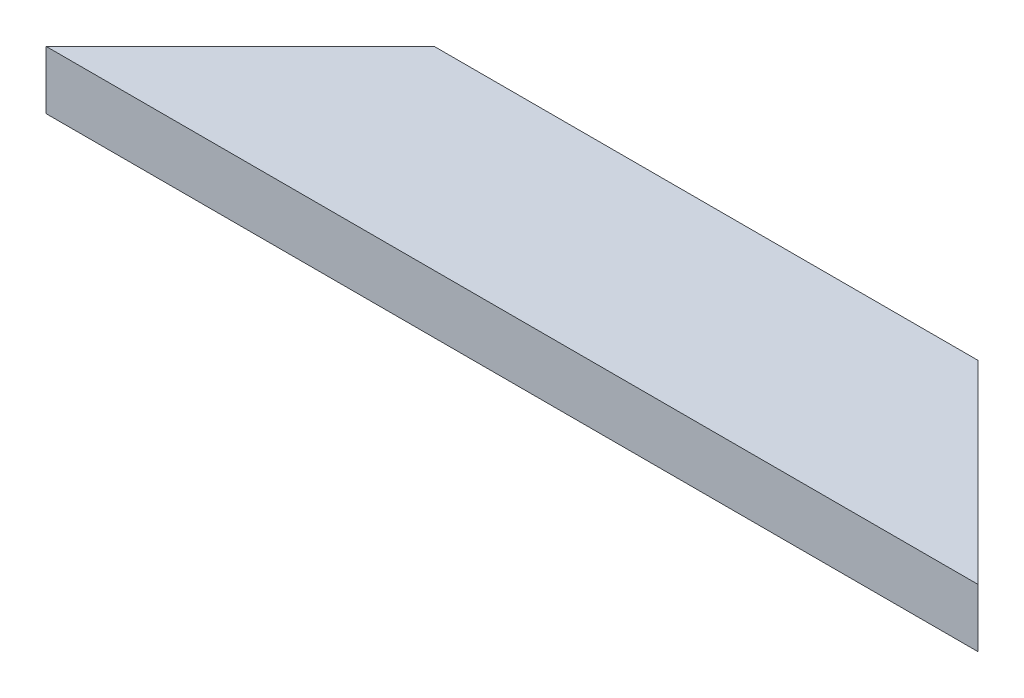
ISO-10303-21;
HEADER;
FILE_DESCRIPTION(('STEP AP214'),'2;1');
FILE_NAME('part.step','',(''),(''),'','','');
FILE_SCHEMA(('AUTOMOTIVE_DESIGN { 1 0 10303 214 1 1 1 1 }'));
ENDSEC;
DATA;
#1=APPLICATION_CONTEXT('core data for automotive mechanical design processes');
#2=APPLICATION_PROTOCOL_DEFINITION('international standard','automotive_design',2000,#1);
#3=PRODUCT_CONTEXT('',#1,'mechanical');
#4=PRODUCT('Part','Part','',(#3));
#5=PRODUCT_RELATED_PRODUCT_CATEGORY('part','',(#4));
#6=PRODUCT_DEFINITION_FORMATION('','',#4);
#7=PRODUCT_DEFINITION_CONTEXT('part definition',#1,'design');
#8=PRODUCT_DEFINITION('design','',#6,#7);
#9=PRODUCT_DEFINITION_SHAPE('','',#8);
#10=(LENGTH_UNIT() NAMED_UNIT(*) SI_UNIT(.MILLI.,.METRE.));
#11=(NAMED_UNIT(*) PLANE_ANGLE_UNIT() SI_UNIT($,.RADIAN.));
#12=(NAMED_UNIT(*) SI_UNIT($,.STERADIAN.) SOLID_ANGLE_UNIT());
#13=UNCERTAINTY_MEASURE_WITH_UNIT(LENGTH_MEASURE(1.E-05),#10,'distance_accuracy_value','');
#14=(GEOMETRIC_REPRESENTATION_CONTEXT(3) GLOBAL_UNCERTAINTY_ASSIGNED_CONTEXT((#13)) GLOBAL_UNIT_ASSIGNED_CONTEXT((#10,
#11,#12)) REPRESENTATION_CONTEXT('',''));
#15=CARTESIAN_POINT('',(0.,0.,0.));
#16=DIRECTION('',(0.,0.,1.));
#17=DIRECTION('',(1.,0.,0.));
#18=AXIS2_PLACEMENT_3D('',#15,#16,#17);
#19=CARTESIAN_POINT('',(71.7394483190541,19.05,-52.9788447933238));
#20=DIRECTION('',(0.707106781186539,0.,-0.707106781186556));
#21=DIRECTION('',(-0.707106781186556,0.,-0.707106781186539));
#22=AXIS2_PLACEMENT_3D('',#19,#20,#21);
#23=PLANE('',#22);
#24=DIRECTION('',(0.707106781186556,0.,0.707106781186539));
#25=VECTOR('',#24,1.);
#26=CARTESIAN_POINT('',(71.7394483190541,0.,-52.9788447933238));
#27=LINE('',#26,#25);
#28=CARTESIAN_POINT('',(71.7394483190541,0.,-52.9788447933238));
#29=VERTEX_POINT('',#28);
#30=CARTESIAN_POINT('',(135.168830646847,0.,10.4505375344672));
#31=VERTEX_POINT('',#30);
#32=EDGE_CURVE('E97',#29,#31,#27,.T.);
#33=ORIENTED_EDGE('',*,*,#32,.F.);
#34=DIRECTION('',(0.,-1.,0.));
#35=VECTOR('',#34,1.);
#36=CARTESIAN_POINT('',(71.7394483190541,19.05,-52.9788447933238));
#37=LINE('',#36,#35);
#38=CARTESIAN_POINT('',(71.7394483190541,19.05,-52.9788447933238));
#39=VERTEX_POINT('',#38);
#40=EDGE_CURVE('E11',#39,#29,#37,.T.);
#41=ORIENTED_EDGE('',*,*,#40,.F.);
#42=DIRECTION('',(0.707106781186556,0.,0.707106781186539));
#43=VECTOR('',#42,1.);
#44=CARTESIAN_POINT('',(71.7394483190541,19.05,-52.9788447933238));
#45=LINE('',#44,#43);
#46=CARTESIAN_POINT('',(135.168830646847,19.05,10.4505375344672));
#47=VERTEX_POINT('',#46);
#48=EDGE_CURVE('E91',#39,#47,#45,.T.);
#49=ORIENTED_EDGE('',*,*,#48,.T.);
#50=DIRECTION('',(0.,-1.,0.));
#51=VECTOR('',#50,1.);
#52=CARTESIAN_POINT('',(135.168830646847,19.05,10.4505375344672));
#53=LINE('',#52,#51);
#54=EDGE_CURVE('E36',#47,#31,#53,.T.);
#55=ORIENTED_EDGE('',*,*,#54,.T.);
#56=EDGE_LOOP('',(#33,#41,#49,#55));
#57=FACE_BOUND('',#56,.T.);
#58=ADVANCED_FACE('F33',(#57),#23,.T.);
#59=CARTESIAN_POINT('',(-106.060551680946,19.05,-52.978844793324));
#60=DIRECTION('',(0.,0.,-1.));
#61=DIRECTION('',(-1.,0.,0.));
#62=AXIS2_PLACEMENT_3D('',#59,#60,#61);
#63=PLANE('',#62);
#64=DIRECTION('',(1.,0.,0.));
#65=VECTOR('',#64,1.);
#66=CARTESIAN_POINT('',(-106.060551680946,0.,-52.978844793324));
#67=LINE('',#66,#65);
#68=CARTESIAN_POINT('',(-106.060551680946,0.,-52.978844793324));
#69=VERTEX_POINT('',#68);
#70=EDGE_CURVE('E93',#69,#29,#67,.T.);
#71=ORIENTED_EDGE('',*,*,#70,.F.);
#72=DIRECTION('',(0.,-1.,0.));
#73=VECTOR('',#72,1.);
#74=CARTESIAN_POINT('',(-106.060551680946,19.05,-52.978844793324));
#75=LINE('',#74,#73);
#76=CARTESIAN_POINT('',(-106.060551680946,19.05,-52.978844793324));
#77=VERTEX_POINT('',#76);
#78=EDGE_CURVE('E42',#77,#69,#75,.T.);
#79=ORIENTED_EDGE('',*,*,#78,.F.);
#80=DIRECTION('',(1.,0.,0.));
#81=VECTOR('',#80,1.);
#82=CARTESIAN_POINT('',(-106.060551680946,19.05,-52.978844793324));
#83=LINE('',#82,#81);
#84=EDGE_CURVE('E84',#77,#39,#83,.T.);
#85=ORIENTED_EDGE('',*,*,#84,.T.);
#86=ORIENTED_EDGE('',*,*,#40,.T.);
#87=EDGE_LOOP('',(#71,#79,#85,#86));
#88=FACE_BOUND('',#87,.T.);
#89=ADVANCED_FACE('F107',(#88),#63,.T.);
#90=CARTESIAN_POINT('',(-106.060551680946,19.05,-52.978844793324));
#91=DIRECTION('',(0.707106781186549,0.,0.707106781186546));
#92=DIRECTION('',(0.707106781186546,0.,-0.707106781186549));
#93=AXIS2_PLACEMENT_3D('',#90,#91,#92);
#94=PLANE('',#93);
#95=DIRECTION('',(-0.707106781186546,0.,0.707106781186549));
#96=VECTOR('',#95,1.);
#97=CARTESIAN_POINT('',(-106.060551680946,0.,-52.978844793324));
#98=LINE('',#97,#96);
#99=CARTESIAN_POINT('',(-169.489934008737,0.,10.4505375344674));
#100=VERTEX_POINT('',#99);
#101=EDGE_CURVE('E88',#69,#100,#98,.T.);
#102=ORIENTED_EDGE('',*,*,#101,.T.);
#103=DIRECTION('',(0.,-1.,0.));
#104=VECTOR('',#103,1.);
#105=CARTESIAN_POINT('',(-169.489934008737,19.05,10.4505375344674));
#106=LINE('',#105,#104);
#107=CARTESIAN_POINT('',(-169.489934008737,19.05,10.4505375344674));
#108=VERTEX_POINT('',#107);
#109=EDGE_CURVE('E86',#108,#100,#106,.T.);
#110=ORIENTED_EDGE('',*,*,#109,.F.);
#111=DIRECTION('',(-0.707106781186546,0.,0.707106781186549));
#112=VECTOR('',#111,1.);
#113=CARTESIAN_POINT('',(-106.060551680946,19.05,-52.978844793324));
#114=LINE('',#113,#112);
#115=EDGE_CURVE('E80',#77,#108,#114,.T.);
#116=ORIENTED_EDGE('',*,*,#115,.F.);
#117=ORIENTED_EDGE('',*,*,#78,.T.);
#118=EDGE_LOOP('',(#102,#110,#116,#117));
#119=FACE_BOUND('',#118,.T.);
#120=ADVANCED_FACE('F87',(#119),#94,.F.);
#121=CARTESIAN_POINT('',(135.168830646847,19.05,10.4505375344672));
#122=DIRECTION('',(0.,0.,1.));
#123=DIRECTION('',(1.,0.,0.));
#124=AXIS2_PLACEMENT_3D('',#121,#122,#123);
#125=PLANE('',#124);
#126=DIRECTION('',(-1.,0.,0.));
#127=VECTOR('',#126,1.);
#128=CARTESIAN_POINT('',(135.168830646847,0.,10.4505375344672));
#129=LINE('',#128,#127);
#130=EDGE_CURVE('E100',#31,#100,#129,.T.);
#131=ORIENTED_EDGE('',*,*,#130,.F.);
#132=ORIENTED_EDGE('',*,*,#54,.F.);
#133=DIRECTION('',(-1.,0.,0.));
#134=VECTOR('',#133,1.);
#135=CARTESIAN_POINT('',(135.168830646847,19.05,10.4505375344672));
#136=LINE('',#135,#134);
#137=EDGE_CURVE('E83',#47,#108,#136,.T.);
#138=ORIENTED_EDGE('',*,*,#137,.T.);
#139=ORIENTED_EDGE('',*,*,#109,.T.);
#140=EDGE_LOOP('',(#131,#132,#138,#139));
#141=FACE_BOUND('',#140,.T.);
#142=ADVANCED_FACE('F90',(#141),#125,.T.);
#143=CARTESIAN_POINT('',(0.,19.05,0.));
#144=DIRECTION('',(0.,-1.,0.));
#145=DIRECTION('',(0.,0.,-1.));
#146=AXIS2_PLACEMENT_3D('',#143,#144,#145);
#147=PLANE('',#146);
#148=ORIENTED_EDGE('',*,*,#48,.F.);
#149=ORIENTED_EDGE('',*,*,#84,.F.);
#150=ORIENTED_EDGE('',*,*,#115,.T.);
#151=ORIENTED_EDGE('',*,*,#137,.F.);
#152=EDGE_LOOP('',(#148,#149,#150,#151));
#153=FACE_BOUND('',#152,.T.);
#154=ADVANCED_FACE('F82',(#153),#147,.F.);
#155=CARTESIAN_POINT('',(0.,0.,0.));
#156=DIRECTION('',(0.,-1.,0.));
#157=DIRECTION('',(0.,0.,-1.));
#158=AXIS2_PLACEMENT_3D('',#155,#156,#157);
#159=PLANE('',#158);
#160=ORIENTED_EDGE('',*,*,#32,.T.);
#161=ORIENTED_EDGE('',*,*,#130,.T.);
#162=ORIENTED_EDGE('',*,*,#101,.F.);
#163=ORIENTED_EDGE('',*,*,#70,.T.);
#164=EDGE_LOOP('',(#160,#161,#162,#163));
#165=FACE_BOUND('',#164,.T.);
#166=ADVANCED_FACE('F106',(#165),#159,.T.);
#167=CLOSED_SHELL('',(#58,#89,#120,#142,#154,#166));
#168=MANIFOLD_SOLID_BREP('B2',#167);
#169=ADVANCED_BREP_SHAPE_REPRESENTATION('',(#18,#168),#14);
#170=SHAPE_DEFINITION_REPRESENTATION(#9,#169);
ENDSEC;
END-ISO-10303-21;
